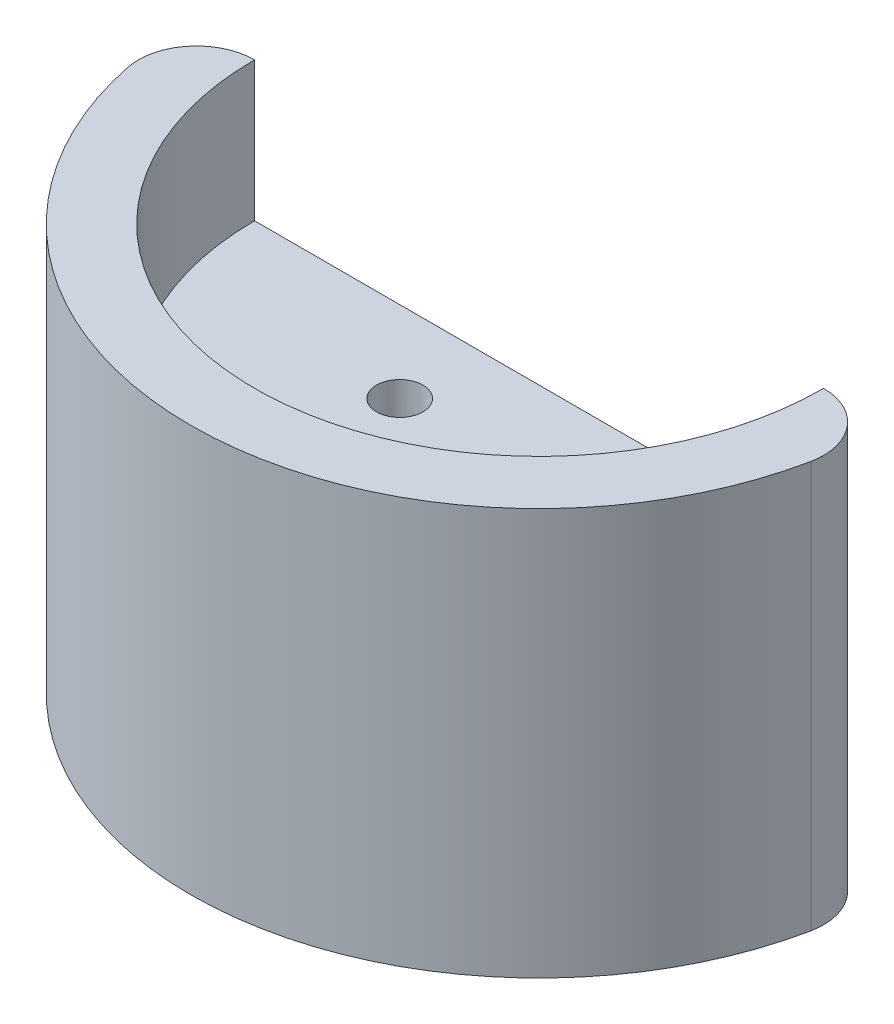
ISO-10303-21;
HEADER;
FILE_DESCRIPTION(('STEP AP214'),'2;1');
FILE_NAME('part.step','',(''),(''),'','','');
FILE_SCHEMA(('AUTOMOTIVE_DESIGN { 1 0 10303 214 1 1 1 1 }'));
ENDSEC;
DATA;
#1=APPLICATION_CONTEXT('core data for automotive mechanical design processes');
#2=APPLICATION_PROTOCOL_DEFINITION('international standard','automotive_design',2000,#1);
#3=PRODUCT_CONTEXT('',#1,'mechanical');
#4=PRODUCT('Part','Part','',(#3));
#5=PRODUCT_RELATED_PRODUCT_CATEGORY('part','',(#4));
#6=PRODUCT_DEFINITION_FORMATION('','',#4);
#7=PRODUCT_DEFINITION_CONTEXT('part definition',#1,'design');
#8=PRODUCT_DEFINITION('design','',#6,#7);
#9=PRODUCT_DEFINITION_SHAPE('','',#8);
#10=(LENGTH_UNIT() NAMED_UNIT(*) SI_UNIT(.MILLI.,.METRE.));
#11=(NAMED_UNIT(*) PLANE_ANGLE_UNIT() SI_UNIT($,.RADIAN.));
#12=(NAMED_UNIT(*) SI_UNIT($,.STERADIAN.) SOLID_ANGLE_UNIT());
#13=UNCERTAINTY_MEASURE_WITH_UNIT(LENGTH_MEASURE(1.E-05),#10,'distance_accuracy_value','');
#14=(GEOMETRIC_REPRESENTATION_CONTEXT(3) GLOBAL_UNCERTAINTY_ASSIGNED_CONTEXT((#13)) GLOBAL_UNIT_ASSIGNED_CONTEXT((#10,
#11,#12)) REPRESENTATION_CONTEXT('',''));
#15=CARTESIAN_POINT('',(0.,0.,0.));
#16=DIRECTION('',(0.,0.,1.));
#17=DIRECTION('',(1.,0.,0.));
#18=AXIS2_PLACEMENT_3D('',#15,#16,#17);
#19=CARTESIAN_POINT('',(-32.4786751234785,5.,-14.2038332264077));
#20=DIRECTION('',(0.,-1.,0.));
#21=DIRECTION('',(0.,0.,-1.));
#22=AXIS2_PLACEMENT_3D('',#19,#20,#21);
#23=CYLINDRICAL_SURFACE('',#22,15.);
#24=CARTESIAN_POINT('',(-32.4786751234785,0.,-14.2038332264077));
#25=DIRECTION('',(0.,-1.,0.));
#26=DIRECTION('',(0.,0.,-1.));
#27=AXIS2_PLACEMENT_3D('',#24,#25,#26);
#28=CIRCLE('',#27,15.);
#29=CARTESIAN_POINT('',(-17.4786751234785,0.,-14.2038332264077));
#30=VERTEX_POINT('',#29);
#31=CARTESIAN_POINT('',(-47.4786751234785,0.,-14.2038332264077));
#32=VERTEX_POINT('',#31);
#33=EDGE_CURVE('E157',#30,#32,#28,.T.);
#34=ORIENTED_EDGE('',*,*,#33,.T.);
#35=DIRECTION('',(0.,-1.,0.));
#36=VECTOR('',#35,1.);
#37=CARTESIAN_POINT('',(-47.4786751234785,5.,-14.2038332264077));
#38=LINE('',#37,#36);
#39=CARTESIAN_POINT('',(-47.4786751234785,5.,-14.2038332264077));
#40=VERTEX_POINT('',#39);
#41=EDGE_CURVE('E148',#40,#32,#38,.T.);
#42=ORIENTED_EDGE('',*,*,#41,.F.);
#43=CARTESIAN_POINT('',(-32.4786751234785,5.,-14.2038332264077));
#44=DIRECTION('',(0.,-1.,0.));
#45=DIRECTION('',(0.,0.,-1.));
#46=AXIS2_PLACEMENT_3D('',#43,#44,#45);
#47=CIRCLE('',#46,15.);
#48=CARTESIAN_POINT('',(-17.4786751234785,5.,-14.2038332264077));
#49=VERTEX_POINT('',#48);
#50=EDGE_CURVE('E156',#49,#40,#47,.T.);
#51=ORIENTED_EDGE('',*,*,#50,.F.);
#52=DIRECTION('',(0.,-1.,0.));
#53=VECTOR('',#52,1.);
#54=CARTESIAN_POINT('',(-17.4786751234785,5.,-14.2038332264077));
#55=LINE('',#54,#53);
#56=EDGE_CURVE('E152',#49,#30,#55,.T.);
#57=ORIENTED_EDGE('',*,*,#56,.T.);
#58=EDGE_LOOP('',(#34,#42,#51,#57));
#59=FACE_BOUND('',#58,.T.);
#60=ADVANCED_FACE('F38',(#59),#23,.F.);
#61=CARTESIAN_POINT('',(-27.4786751234785,5.,-14.2038332264077));
#62=DIRECTION('',(0.,-1.,0.));
#63=DIRECTION('',(0.,0.,-1.));
#64=AXIS2_PLACEMENT_3D('',#61,#62,#63);
#65=CYLINDRICAL_SURFACE('',#64,30.);
#66=CARTESIAN_POINT('',(-27.4786751234785,20.,-14.2038332264077));
#67=DIRECTION('',(0.,1.,0.));
#68=DIRECTION('',(0.,0.,1.));
#69=AXIS2_PLACEMENT_3D('',#66,#67,#68);
#70=CIRCLE('',#69,30.);
#71=CARTESIAN_POINT('',(-56.8725520368766,20.,-8.20383322640773));
#72=VERTEX_POINT('',#71);
#73=CARTESIAN_POINT('',(1.91520178991966,20.,-8.20383322640772));
#74=VERTEX_POINT('',#73);
#75=EDGE_CURVE('E161',#72,#74,#70,.T.);
#76=ORIENTED_EDGE('',*,*,#75,.F.);
#77=DIRECTION('',(0.,-1.,0.));
#78=VECTOR('',#77,1.);
#79=CARTESIAN_POINT('',(-56.8725520368766,5.,-8.20383322640773));
#80=LINE('',#79,#78);
#81=CARTESIAN_POINT('',(-56.8725520368766,-15.,-8.20383322640773));
#82=VERTEX_POINT('',#81);
#83=EDGE_CURVE('E128',#72,#82,#80,.T.);
#84=ORIENTED_EDGE('',*,*,#83,.T.);
#85=CARTESIAN_POINT('',(-27.4786751234785,-15.,-14.2038332264077));
#86=DIRECTION('',(0.,-1.,0.));
#87=DIRECTION('',(0.,0.,-1.));
#88=AXIS2_PLACEMENT_3D('',#85,#86,#87);
#89=CIRCLE('',#88,30.);
#90=CARTESIAN_POINT('',(1.91520178991966,-15.,-8.20383322640772));
#91=VERTEX_POINT('',#90);
#92=EDGE_CURVE('E169',#91,#82,#89,.T.);
#93=ORIENTED_EDGE('',*,*,#92,.F.);
#94=DIRECTION('',(0.,-1.,0.));
#95=VECTOR('',#94,1.);
#96=CARTESIAN_POINT('',(1.91520178991967,5.,-8.20383322640772));
#97=LINE('',#96,#95);
#98=EDGE_CURVE('E138',#91,#74,#97,.F.);
#99=ORIENTED_EDGE('',*,*,#98,.T.);
#100=EDGE_LOOP('',(#76,#84,#93,#99));
#101=FACE_BOUND('',#100,.T.);
#102=ADVANCED_FACE('F248',(#101),#65,.T.);
#103=CARTESIAN_POINT('',(-17.4786751234785,5.,-14.2038332264077));
#104=DIRECTION('',(0.,0.,1.));
#105=DIRECTION('',(1.,0.,0.));
#106=AXIS2_PLACEMENT_3D('',#103,#104,#105);
#107=PLANE('',#106);
#108=DIRECTION('',(1.,0.,0.));
#109=VECTOR('',#108,1.);
#110=CARTESIAN_POINT('',(2.52132487652153,0.,-14.2038332264077));
#111=LINE('',#110,#109);
#112=EDGE_CURVE('E172',#32,#30,#111,.T.);
#113=ORIENTED_EDGE('',*,*,#112,.T.);
#114=ORIENTED_EDGE('',*,*,#56,.F.);
#115=DIRECTION('',(-1.,0.,0.));
#116=VECTOR('',#115,1.);
#117=CARTESIAN_POINT('',(-57.4786751234785,5.,-14.2038332264077));
#118=LINE('',#117,#116);
#119=EDGE_CURVE('E165',#49,#40,#118,.T.);
#120=ORIENTED_EDGE('',*,*,#119,.T.);
#121=ORIENTED_EDGE('',*,*,#41,.T.);
#122=EDGE_LOOP('',(#113,#114,#120,#121));
#123=FACE_BOUND('',#122,.T.);
#124=DIRECTION('',(0.,-1.,0.));
#125=VECTOR('',#124,1.);
#126=CARTESIAN_POINT('',(-2.98377769564669,5.,-14.2038332264077));
#127=LINE('',#126,#125);
#128=CARTESIAN_POINT('',(-2.98377769564669,8.,-14.2038332264077));
#129=VERTEX_POINT('',#128);
#130=CARTESIAN_POINT('',(-2.98377769564669,-3.,-14.2038332264077));
#131=VERTEX_POINT('',#130);
#132=EDGE_CURVE('E118',#129,#131,#127,.T.);
#133=ORIENTED_EDGE('',*,*,#132,.T.);
#134=DIRECTION('',(1.,0.,0.));
#135=VECTOR('',#134,1.);
#136=CARTESIAN_POINT('',(-51.9735725513102,-3.,-14.2038332264077));
#137=LINE('',#136,#135);
#138=CARTESIAN_POINT('',(-51.9735725513102,-3.,-14.2038332264077));
#139=VERTEX_POINT('',#138);
#140=EDGE_CURVE('E111',#139,#131,#137,.T.);
#141=ORIENTED_EDGE('',*,*,#140,.F.);
#142=DIRECTION('',(0.,-1.,0.));
#143=VECTOR('',#142,1.);
#144=CARTESIAN_POINT('',(-51.9735725513102,5.,-14.2038332264077));
#145=LINE('',#144,#143);
#146=CARTESIAN_POINT('',(-51.9735725513102,8.,-14.2038332264077));
#147=VERTEX_POINT('',#146);
#148=EDGE_CURVE('E54',#139,#147,#145,.F.);
#149=ORIENTED_EDGE('',*,*,#148,.T.);
#150=DIRECTION('',(-1.,0.,0.));
#151=VECTOR('',#150,1.);
#152=CARTESIAN_POINT('',(-51.9735725513102,8.,-14.2038332264077));
#153=LINE('',#152,#151);
#154=EDGE_CURVE('E181',#129,#147,#153,.T.);
#155=ORIENTED_EDGE('',*,*,#154,.F.);
#156=EDGE_LOOP('',(#133,#141,#149,#155));
#157=FACE_BOUND('',#156,.T.);
#158=ADVANCED_FACE('F116',(#123,#157),#107,.F.);
#159=CARTESIAN_POINT('',(-27.4786751234785,5.,-14.2038332264077));
#160=DIRECTION('',(0.,1.,0.));
#161=DIRECTION('',(0.,0.,1.));
#162=AXIS2_PLACEMENT_3D('',#159,#160,#161);
#163=PLANE('',#162);
#164=CARTESIAN_POINT('',(-32.4786751234785,5.,-7.20383322640772));
#165=DIRECTION('',(0.,1.,0.));
#166=DIRECTION('',(0.,0.,1.));
#167=AXIS2_PLACEMENT_3D('',#164,#165,#166);
#168=CIRCLE('',#167,2.);
#169=CARTESIAN_POINT('',(-32.4786751234785,5.,-5.20383322640772));
#170=VERTEX_POINT('',#169);
#171=EDGE_CURVE('E194',#170,#170,#168,.T.);
#172=ORIENTED_EDGE('',*,*,#171,.T.);
#173=EDGE_LOOP('',(#172));
#174=FACE_BOUND('',#173,.T.);
#175=ORIENTED_EDGE('',*,*,#119,.F.);
#176=ORIENTED_EDGE('',*,*,#50,.T.);
#177=EDGE_LOOP('',(#175,#176));
#178=FACE_BOUND('',#177,.T.);
#179=ADVANCED_FACE('F222',(#174,#178),#163,.F.);
#180=CARTESIAN_POINT('',(-27.4786751234785,20.,-14.2038332264077));
#181=DIRECTION('',(0.,1.,0.));
#182=DIRECTION('',(0.,0.,1.));
#183=AXIS2_PLACEMENT_3D('',#180,#181,#182);
#184=PLANE('',#183);
#185=CARTESIAN_POINT('',(-27.4786751234785,20.,-14.2038332264077));
#186=DIRECTION('',(0.,1.,0.));
#187=DIRECTION('',(0.,0.,-1.));
#188=AXIS2_PLACEMENT_3D('',#185,#186,#187);
#189=CIRCLE('',#188,24.4948974278318);
#190=CARTESIAN_POINT('',(-51.9735725513102,20.,-14.2038332264077));
#191=VERTEX_POINT('',#190);
#192=CARTESIAN_POINT('',(-2.98377769564669,20.,-14.2038332264077));
#193=VERTEX_POINT('',#192);
#194=EDGE_CURVE('E182',#191,#193,#189,.T.);
#195=ORIENTED_EDGE('',*,*,#194,.F.);
#196=CARTESIAN_POINT('',(-51.9735725513102,20.,-9.20383322640773));
#197=DIRECTION('',(0.,1.,0.));
#198=DIRECTION('',(0.,0.,1.));
#199=AXIS2_PLACEMENT_3D('',#196,#197,#198);
#200=CIRCLE('',#199,5.);
#201=EDGE_CURVE('E11',#191,#72,#200,.T.);
#202=ORIENTED_EDGE('',*,*,#201,.T.);
#203=ORIENTED_EDGE('',*,*,#75,.T.);
#204=CARTESIAN_POINT('',(-2.98377769564669,20.,-9.20383322640773));
#205=DIRECTION('',(0.,1.,0.));
#206=DIRECTION('',(0.,0.,1.));
#207=AXIS2_PLACEMENT_3D('',#204,#205,#206);
#208=CIRCLE('',#207,5.);
#209=EDGE_CURVE('E134',#74,#193,#208,.T.);
#210=ORIENTED_EDGE('',*,*,#209,.T.);
#211=EDGE_LOOP('',(#195,#202,#203,#210));
#212=FACE_BOUND('',#211,.T.);
#213=ADVANCED_FACE('F225',(#212),#184,.T.);
#214=CARTESIAN_POINT('',(-27.4786751234785,0.,-14.2038332264077));
#215=DIRECTION('',(0.,-1.,0.));
#216=DIRECTION('',(0.,0.,-1.));
#217=AXIS2_PLACEMENT_3D('',#214,#215,#216);
#218=PLANE('',#217);
#219=CARTESIAN_POINT('',(-32.4786751234785,0.,-7.20383322640772));
#220=DIRECTION('',(0.,-1.,0.));
#221=DIRECTION('',(0.,0.,-1.));
#222=AXIS2_PLACEMENT_3D('',#219,#220,#221);
#223=CIRCLE('',#222,2.);
#224=CARTESIAN_POINT('',(-32.4786751234785,0.,-9.20383322640772));
#225=VERTEX_POINT('',#224);
#226=EDGE_CURVE('E199',#225,#225,#223,.T.);
#227=ORIENTED_EDGE('',*,*,#226,.T.);
#228=EDGE_LOOP('',(#227));
#229=FACE_BOUND('',#228,.T.);
#230=ORIENTED_EDGE('',*,*,#33,.F.);
#231=ORIENTED_EDGE('',*,*,#112,.F.);
#232=EDGE_LOOP('',(#230,#231));
#233=FACE_BOUND('',#232,.T.);
#234=ADVANCED_FACE('F232',(#229,#233),#218,.F.);
#235=CARTESIAN_POINT('',(-27.4786751234785,-15.,-14.2038332264077));
#236=DIRECTION('',(0.,-1.,0.));
#237=DIRECTION('',(0.,0.,-1.));
#238=AXIS2_PLACEMENT_3D('',#235,#236,#237);
#239=PLANE('',#238);
#240=CARTESIAN_POINT('',(-27.4786751234785,-15.,-14.2038332264077));
#241=DIRECTION('',(0.,-1.,0.));
#242=DIRECTION('',(0.,0.,1.));
#243=AXIS2_PLACEMENT_3D('',#240,#241,#242);
#244=CIRCLE('',#243,24.4948974278318);
#245=CARTESIAN_POINT('',(-2.98377769564669,-15.,-14.2038332264077));
#246=VERTEX_POINT('',#245);
#247=CARTESIAN_POINT('',(-51.9735725513102,-15.,-14.2038332264077));
#248=VERTEX_POINT('',#247);
#249=EDGE_CURVE('E62',#246,#248,#244,.T.);
#250=ORIENTED_EDGE('',*,*,#249,.F.);
#251=CARTESIAN_POINT('',(-2.98377769564669,-15.,-9.20383322640773));
#252=DIRECTION('',(0.,-1.,0.));
#253=DIRECTION('',(0.,0.,-1.));
#254=AXIS2_PLACEMENT_3D('',#251,#252,#253);
#255=CIRCLE('',#254,5.);
#256=EDGE_CURVE('E142',#246,#91,#255,.T.);
#257=ORIENTED_EDGE('',*,*,#256,.T.);
#258=ORIENTED_EDGE('',*,*,#92,.T.);
#259=CARTESIAN_POINT('',(-51.9735725513102,-15.,-9.20383322640773));
#260=DIRECTION('',(0.,-1.,0.));
#261=DIRECTION('',(0.,0.,-1.));
#262=AXIS2_PLACEMENT_3D('',#259,#260,#261);
#263=CIRCLE('',#262,5.);
#264=EDGE_CURVE('E126',#82,#248,#263,.T.);
#265=ORIENTED_EDGE('',*,*,#264,.T.);
#266=EDGE_LOOP('',(#250,#257,#258,#265));
#267=FACE_BOUND('',#266,.T.);
#268=ADVANCED_FACE('F234',(#267),#239,.T.);
#269=CARTESIAN_POINT('',(-2.98377769564669,5.,-9.20383322640773));
#270=DIRECTION('',(0.,-1.,0.));
#271=DIRECTION('',(0.,0.,-1.));
#272=AXIS2_PLACEMENT_3D('',#269,#270,#271);
#273=CYLINDRICAL_SURFACE('',#272,5.);
#274=ORIENTED_EDGE('',*,*,#209,.F.);
#275=ORIENTED_EDGE('',*,*,#98,.F.);
#276=ORIENTED_EDGE('',*,*,#256,.F.);
#277=DIRECTION('',(0.,-1.,0.));
#278=VECTOR('',#277,1.);
#279=CARTESIAN_POINT('',(-2.98377769564669,-3.,-14.2038332264077));
#280=LINE('',#279,#278);
#281=EDGE_CURVE('E120',#131,#246,#280,.T.);
#282=ORIENTED_EDGE('',*,*,#281,.F.);
#283=ORIENTED_EDGE('',*,*,#132,.F.);
#284=EDGE_CURVE('E145',#193,#129,#127,.T.);
#285=ORIENTED_EDGE('',*,*,#284,.F.);
#286=EDGE_LOOP('',(#274,#275,#276,#282,#283,#285));
#287=FACE_BOUND('',#286,.T.);
#288=ADVANCED_FACE('F241',(#287),#273,.T.);
#289=CARTESIAN_POINT('',(-51.9735725513102,5.,-9.20383322640773));
#290=DIRECTION('',(0.,-1.,0.));
#291=DIRECTION('',(0.,0.,-1.));
#292=AXIS2_PLACEMENT_3D('',#289,#290,#291);
#293=CYLINDRICAL_SURFACE('',#292,5.);
#294=ORIENTED_EDGE('',*,*,#201,.F.);
#295=DIRECTION('',(0.,1.,0.));
#296=VECTOR('',#295,1.);
#297=CARTESIAN_POINT('',(-51.9735725513102,8.,-14.2038332264077));
#298=LINE('',#297,#296);
#299=EDGE_CURVE('E124',#147,#191,#298,.T.);
#300=ORIENTED_EDGE('',*,*,#299,.F.);
#301=ORIENTED_EDGE('',*,*,#148,.F.);
#302=EDGE_CURVE('E47',#248,#139,#145,.F.);
#303=ORIENTED_EDGE('',*,*,#302,.F.);
#304=ORIENTED_EDGE('',*,*,#264,.F.);
#305=ORIENTED_EDGE('',*,*,#83,.F.);
#306=EDGE_LOOP('',(#294,#300,#301,#303,#304,#305));
#307=FACE_BOUND('',#306,.T.);
#308=ADVANCED_FACE('F40',(#307),#293,.T.);
#309=CARTESIAN_POINT('',(-27.4786751234785,8.,-14.2038332264077));
#310=DIRECTION('',(0.,1.,0.));
#311=DIRECTION('',(0.,0.,1.));
#312=AXIS2_PLACEMENT_3D('',#309,#310,#311);
#313=CYLINDRICAL_SURFACE('',#312,24.4948974278318);
#314=ORIENTED_EDGE('',*,*,#194,.T.);
#315=ORIENTED_EDGE('',*,*,#284,.T.);
#316=CARTESIAN_POINT('',(-27.4786751234785,8.,-14.2038332264077));
#317=DIRECTION('',(0.,1.,0.));
#318=DIRECTION('',(0.,0.,-1.));
#319=AXIS2_PLACEMENT_3D('',#316,#317,#318);
#320=CIRCLE('',#319,24.4948974278318);
#321=EDGE_CURVE('E185',#147,#129,#320,.T.);
#322=ORIENTED_EDGE('',*,*,#321,.F.);
#323=ORIENTED_EDGE('',*,*,#299,.T.);
#324=EDGE_LOOP('',(#314,#315,#322,#323));
#325=FACE_BOUND('',#324,.T.);
#326=ADVANCED_FACE('F261',(#325),#313,.F.);
#327=CARTESIAN_POINT('',(-27.4786751234785,8.,-14.2038332264077));
#328=DIRECTION('',(0.,-1.,0.));
#329=DIRECTION('',(0.,0.,-1.));
#330=AXIS2_PLACEMENT_3D('',#327,#328,#329);
#331=PLANE('',#330);
#332=CARTESIAN_POINT('',(-32.4786751234785,7.99999999999999,-7.20383322640772));
#333=DIRECTION('',(0.,-1.,0.));
#334=DIRECTION('',(0.,0.,-1.));
#335=AXIS2_PLACEMENT_3D('',#332,#333,#334);
#336=CIRCLE('',#335,2.);
#337=CARTESIAN_POINT('',(-32.4786751234785,7.99999999999999,-9.20383322640772));
#338=VERTEX_POINT('',#337);
#339=EDGE_CURVE('E203',#338,#338,#336,.T.);
#340=ORIENTED_EDGE('',*,*,#339,.T.);
#341=EDGE_LOOP('',(#340));
#342=FACE_BOUND('',#341,.T.);
#343=ORIENTED_EDGE('',*,*,#321,.T.);
#344=ORIENTED_EDGE('',*,*,#154,.T.);
#345=EDGE_LOOP('',(#343,#344));
#346=FACE_BOUND('',#345,.T.);
#347=ADVANCED_FACE('F212',(#342,#346),#331,.F.);
#348=CARTESIAN_POINT('',(-27.4786751234785,-3.,-14.2038332264077));
#349=DIRECTION('',(0.,-1.,0.));
#350=DIRECTION('',(0.,0.,-1.));
#351=AXIS2_PLACEMENT_3D('',#348,#349,#350);
#352=CYLINDRICAL_SURFACE('',#351,24.4948974278318);
#353=ORIENTED_EDGE('',*,*,#249,.T.);
#354=ORIENTED_EDGE('',*,*,#302,.T.);
#355=CARTESIAN_POINT('',(-27.4786751234785,-3.,-14.2038332264077));
#356=DIRECTION('',(0.,-1.,0.));
#357=DIRECTION('',(0.,0.,1.));
#358=AXIS2_PLACEMENT_3D('',#355,#356,#357);
#359=CIRCLE('',#358,24.4948974278318);
#360=EDGE_CURVE('E105',#131,#139,#359,.T.);
#361=ORIENTED_EDGE('',*,*,#360,.F.);
#362=ORIENTED_EDGE('',*,*,#281,.T.);
#363=EDGE_LOOP('',(#353,#354,#361,#362));
#364=FACE_BOUND('',#363,.T.);
#365=ADVANCED_FACE('F104',(#364),#352,.F.);
#366=CARTESIAN_POINT('',(-27.4786751234785,-3.,-14.2038332264077));
#367=DIRECTION('',(0.,1.,0.));
#368=DIRECTION('',(0.,0.,1.));
#369=AXIS2_PLACEMENT_3D('',#366,#367,#368);
#370=PLANE('',#369);
#371=CARTESIAN_POINT('',(-32.4786751234785,-3.,-7.20383322640772));
#372=DIRECTION('',(0.,-1.,0.));
#373=DIRECTION('',(0.,0.,-1.));
#374=AXIS2_PLACEMENT_3D('',#371,#372,#373);
#375=CIRCLE('',#374,2.);
#376=CARTESIAN_POINT('',(-32.4786751234785,-3.,-9.20383322640772));
#377=VERTEX_POINT('',#376);
#378=EDGE_CURVE('E204',#377,#377,#375,.T.);
#379=ORIENTED_EDGE('',*,*,#378,.F.);
#380=EDGE_LOOP('',(#379));
#381=FACE_BOUND('',#380,.T.);
#382=ORIENTED_EDGE('',*,*,#360,.T.);
#383=ORIENTED_EDGE('',*,*,#140,.T.);
#384=EDGE_LOOP('',(#382,#383));
#385=FACE_BOUND('',#384,.T.);
#386=ADVANCED_FACE('F110',(#381,#385),#370,.F.);
#387=CARTESIAN_POINT('',(-32.4786751234785,7.99999999999999,-7.20383322640772));
#388=DIRECTION('',(0.,-1.,0.));
#389=DIRECTION('',(0.,0.,-1.));
#390=AXIS2_PLACEMENT_3D('',#387,#388,#389);
#391=CYLINDRICAL_SURFACE('',#390,2.);
#392=ORIENTED_EDGE('',*,*,#378,.T.);
#393=EDGE_LOOP('',(#392));
#394=FACE_BOUND('',#393,.T.);
#395=ORIENTED_EDGE('',*,*,#226,.F.);
#396=EDGE_LOOP('',(#395));
#397=FACE_BOUND('',#396,.T.);
#398=ADVANCED_FACE('F218',(#394,#397),#391,.F.);
#399=ORIENTED_EDGE('',*,*,#339,.F.);
#400=EDGE_LOOP('',(#399));
#401=FACE_BOUND('',#400,.T.);
#402=ORIENTED_EDGE('',*,*,#171,.F.);
#403=EDGE_LOOP('',(#402));
#404=FACE_BOUND('',#403,.T.);
#405=ADVANCED_FACE('F215',(#401,#404),#391,.F.);
#406=CLOSED_SHELL('',(#60,#102,#158,#179,#213,#234,#268,#288,#308,#326,#347,#365,#386,#398,#405));
#407=MANIFOLD_SOLID_BREP('B2',#406);
#408=ADVANCED_BREP_SHAPE_REPRESENTATION('',(#18,#407),#14);
#409=SHAPE_DEFINITION_REPRESENTATION(#9,#408);
ENDSEC;
END-ISO-10303-21;
